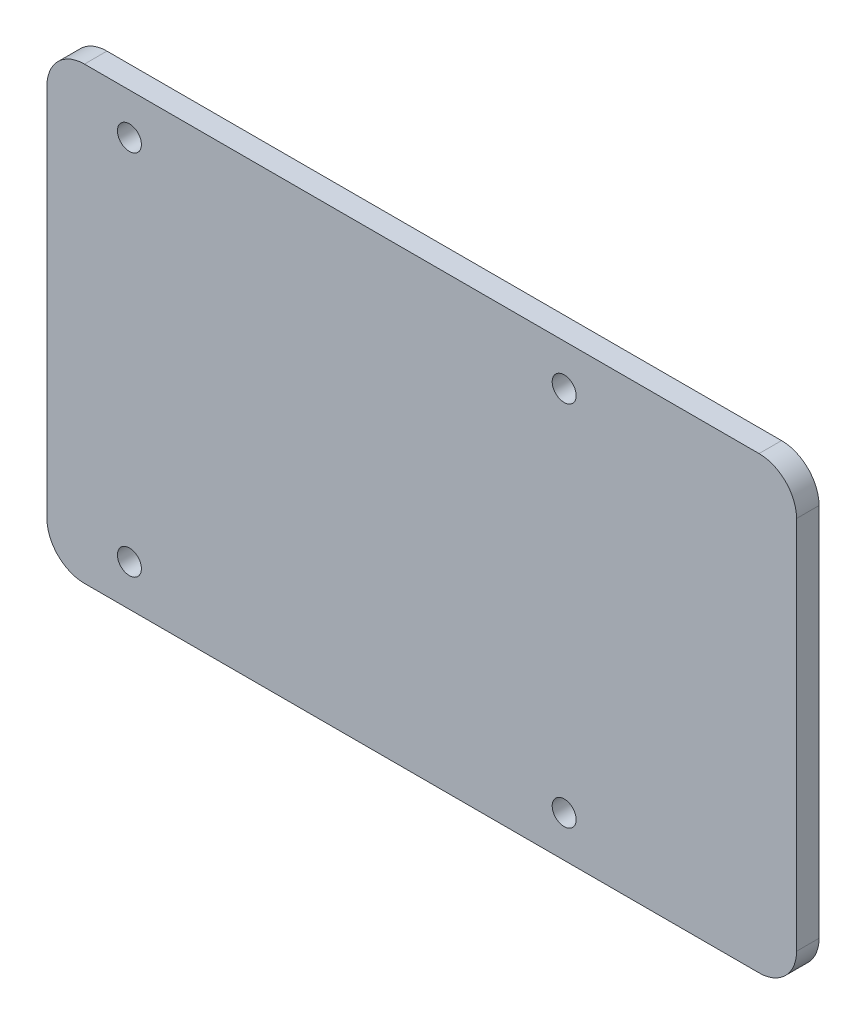
ISO-10303-21;
HEADER;
FILE_DESCRIPTION(('STEP AP214'),'2;1');
FILE_NAME('part.step','',(''),(''),'','','');
FILE_SCHEMA(('AUTOMOTIVE_DESIGN { 1 0 10303 214 1 1 1 1 }'));
ENDSEC;
DATA;
#1=APPLICATION_CONTEXT('core data for automotive mechanical design processes');
#2=APPLICATION_PROTOCOL_DEFINITION('international standard','automotive_design',2000,#1);
#3=PRODUCT_CONTEXT('',#1,'mechanical');
#4=PRODUCT('Part','Part','',(#3));
#5=PRODUCT_RELATED_PRODUCT_CATEGORY('part','',(#4));
#6=PRODUCT_DEFINITION_FORMATION('','',#4);
#7=PRODUCT_DEFINITION_CONTEXT('part definition',#1,'design');
#8=PRODUCT_DEFINITION('design','',#6,#7);
#9=PRODUCT_DEFINITION_SHAPE('','',#8);
#10=(LENGTH_UNIT() NAMED_UNIT(*) SI_UNIT(.MILLI.,.METRE.));
#11=(NAMED_UNIT(*) PLANE_ANGLE_UNIT() SI_UNIT($,.RADIAN.));
#12=(NAMED_UNIT(*) SI_UNIT($,.STERADIAN.) SOLID_ANGLE_UNIT());
#13=UNCERTAINTY_MEASURE_WITH_UNIT(LENGTH_MEASURE(1.E-05),#10,'distance_accuracy_value','');
#14=(GEOMETRIC_REPRESENTATION_CONTEXT(3) GLOBAL_UNCERTAINTY_ASSIGNED_CONTEXT((#13)) GLOBAL_UNIT_ASSIGNED_CONTEXT((#10,
#11,#12)) REPRESENTATION_CONTEXT('',''));
#15=CARTESIAN_POINT('',(0.,0.,0.));
#16=DIRECTION('',(0.,0.,1.));
#17=DIRECTION('',(1.,0.,0.));
#18=AXIS2_PLACEMENT_3D('',#15,#16,#17);
#19=CARTESIAN_POINT('',(-45.,-25.,3.));
#20=DIRECTION('',(0.,0.,1.));
#21=DIRECTION('',(1.,0.,0.));
#22=AXIS2_PLACEMENT_3D('',#19,#20,#21);
#23=PLANE('',#22);
#24=CARTESIAN_POINT('',(-39.,-24.5,3.));
#25=DIRECTION('',(0.,0.,1.));
#26=DIRECTION('',(1.,0.,0.));
#27=AXIS2_PLACEMENT_3D('',#24,#25,#26);
#28=CIRCLE('',#27,1.6);
#29=CARTESIAN_POINT('',(-37.4,-24.5,3.));
#30=VERTEX_POINT('',#29);
#31=EDGE_CURVE('E224',#30,#30,#28,.T.);
#32=ORIENTED_EDGE('',*,*,#31,.F.);
#33=EDGE_LOOP('',(#32));
#34=FACE_BOUND('',#33,.T.);
#35=CARTESIAN_POINT('',(19.,24.5,3.));
#36=DIRECTION('',(0.,0.,1.));
#37=DIRECTION('',(1.,0.,0.));
#38=AXIS2_PLACEMENT_3D('',#35,#36,#37);
#39=CIRCLE('',#38,1.6);
#40=CARTESIAN_POINT('',(20.6,24.5,3.));
#41=VERTEX_POINT('',#40);
#42=EDGE_CURVE('E149',#41,#41,#39,.T.);
#43=ORIENTED_EDGE('',*,*,#42,.F.);
#44=EDGE_LOOP('',(#43));
#45=FACE_BOUND('',#44,.T.);
#46=CARTESIAN_POINT('',(-45.,-25.,3.));
#47=DIRECTION('',(0.,0.,1.));
#48=DIRECTION('',(1.,0.,0.));
#49=AXIS2_PLACEMENT_3D('',#46,#47,#48);
#50=CIRCLE('',#49,5.);
#51=CARTESIAN_POINT('',(-50.,-25.,3.));
#52=VERTEX_POINT('',#51);
#53=CARTESIAN_POINT('',(-45.,-30.,3.));
#54=VERTEX_POINT('',#53);
#55=EDGE_CURVE('E167',#52,#54,#50,.T.);
#56=ORIENTED_EDGE('',*,*,#55,.T.);
#57=DIRECTION('',(1.,0.,0.));
#58=VECTOR('',#57,1.);
#59=CARTESIAN_POINT('',(-45.,-30.,3.));
#60=LINE('',#59,#58);
#61=CARTESIAN_POINT('',(45.,-30.,3.));
#62=VERTEX_POINT('',#61);
#63=EDGE_CURVE('E103',#54,#62,#60,.T.);
#64=ORIENTED_EDGE('',*,*,#63,.T.);
#65=CARTESIAN_POINT('',(45.,-25.,3.));
#66=DIRECTION('',(0.,0.,1.));
#67=DIRECTION('',(1.,0.,0.));
#68=AXIS2_PLACEMENT_3D('',#65,#66,#67);
#69=CIRCLE('',#68,5.);
#70=CARTESIAN_POINT('',(50.,-25.,3.));
#71=VERTEX_POINT('',#70);
#72=EDGE_CURVE('E188',#62,#71,#69,.T.);
#73=ORIENTED_EDGE('',*,*,#72,.T.);
#74=DIRECTION('',(0.,1.,0.));
#75=VECTOR('',#74,1.);
#76=CARTESIAN_POINT('',(50.,25.,3.));
#77=LINE('',#76,#75);
#78=CARTESIAN_POINT('',(50.,25.,3.));
#79=VERTEX_POINT('',#78);
#80=EDGE_CURVE('E202',#71,#79,#77,.T.);
#81=ORIENTED_EDGE('',*,*,#80,.T.);
#82=CARTESIAN_POINT('',(45.,25.,3.));
#83=DIRECTION('',(0.,0.,1.));
#84=DIRECTION('',(-1.,0.,0.));
#85=AXIS2_PLACEMENT_3D('',#82,#83,#84);
#86=CIRCLE('',#85,5.);
#87=CARTESIAN_POINT('',(45.,30.,3.));
#88=VERTEX_POINT('',#87);
#89=EDGE_CURVE('E122',#79,#88,#86,.T.);
#90=ORIENTED_EDGE('',*,*,#89,.T.);
#91=DIRECTION('',(-1.,0.,0.));
#92=VECTOR('',#91,1.);
#93=CARTESIAN_POINT('',(-45.,30.,3.));
#94=LINE('',#93,#92);
#95=CARTESIAN_POINT('',(-45.,30.,3.));
#96=VERTEX_POINT('',#95);
#97=EDGE_CURVE('E116',#88,#96,#94,.T.);
#98=ORIENTED_EDGE('',*,*,#97,.T.);
#99=CARTESIAN_POINT('',(-45.,25.,3.));
#100=DIRECTION('',(0.,0.,1.));
#101=DIRECTION('',(1.,0.,0.));
#102=AXIS2_PLACEMENT_3D('',#99,#100,#101);
#103=CIRCLE('',#102,5.);
#104=CARTESIAN_POINT('',(-50.,25.,3.));
#105=VERTEX_POINT('',#104);
#106=EDGE_CURVE('E120',#96,#105,#103,.T.);
#107=ORIENTED_EDGE('',*,*,#106,.T.);
#108=DIRECTION('',(0.,-1.,0.));
#109=VECTOR('',#108,1.);
#110=CARTESIAN_POINT('',(-50.,25.,3.));
#111=LINE('',#110,#109);
#112=EDGE_CURVE('E60',#105,#52,#111,.T.);
#113=ORIENTED_EDGE('',*,*,#112,.T.);
#114=EDGE_LOOP('',(#56,#64,#73,#81,#90,#98,#107,#113));
#115=FACE_BOUND('',#114,.T.);
#116=CARTESIAN_POINT('',(19.,-24.5,3.));
#117=DIRECTION('',(0.,0.,1.));
#118=DIRECTION('',(1.,0.,0.));
#119=AXIS2_PLACEMENT_3D('',#116,#117,#118);
#120=CIRCLE('',#119,1.6);
#121=CARTESIAN_POINT('',(20.6,-24.5,3.));
#122=VERTEX_POINT('',#121);
#123=EDGE_CURVE('E216',#122,#122,#120,.T.);
#124=ORIENTED_EDGE('',*,*,#123,.F.);
#125=EDGE_LOOP('',(#124));
#126=FACE_BOUND('',#125,.T.);
#127=CARTESIAN_POINT('',(-39.,24.5,3.));
#128=DIRECTION('',(0.,0.,1.));
#129=DIRECTION('',(1.,0.,0.));
#130=AXIS2_PLACEMENT_3D('',#127,#128,#129);
#131=CIRCLE('',#130,1.6);
#132=CARTESIAN_POINT('',(-37.4,24.5,3.));
#133=VERTEX_POINT('',#132);
#134=EDGE_CURVE('E232',#133,#133,#131,.T.);
#135=ORIENTED_EDGE('',*,*,#134,.F.);
#136=EDGE_LOOP('',(#135));
#137=FACE_BOUND('',#136,.T.);
#138=ADVANCED_FACE('F42',(#34,#45,#115,#126,#137),#23,.T.);
#139=CARTESIAN_POINT('',(-45.,-25.,0.));
#140=DIRECTION('',(0.,0.,1.));
#141=DIRECTION('',(1.,0.,0.));
#142=AXIS2_PLACEMENT_3D('',#139,#140,#141);
#143=PLANE('',#142);
#144=CARTESIAN_POINT('',(-45.,-25.,0.));
#145=DIRECTION('',(0.,0.,1.));
#146=DIRECTION('',(1.,0.,0.));
#147=AXIS2_PLACEMENT_3D('',#144,#145,#146);
#148=CIRCLE('',#147,5.);
#149=CARTESIAN_POINT('',(-50.,-25.,0.));
#150=VERTEX_POINT('',#149);
#151=CARTESIAN_POINT('',(-45.,-30.,0.));
#152=VERTEX_POINT('',#151);
#153=EDGE_CURVE('E144',#150,#152,#148,.T.);
#154=ORIENTED_EDGE('',*,*,#153,.F.);
#155=DIRECTION('',(0.,-1.,0.));
#156=VECTOR('',#155,1.);
#157=CARTESIAN_POINT('',(-50.,25.,0.));
#158=LINE('',#157,#156);
#159=CARTESIAN_POINT('',(-50.,25.,0.));
#160=VERTEX_POINT('',#159);
#161=EDGE_CURVE('E95',#160,#150,#158,.T.);
#162=ORIENTED_EDGE('',*,*,#161,.F.);
#163=CARTESIAN_POINT('',(-45.,25.,0.));
#164=DIRECTION('',(0.,0.,1.));
#165=DIRECTION('',(1.,0.,0.));
#166=AXIS2_PLACEMENT_3D('',#163,#164,#165);
#167=CIRCLE('',#166,5.);
#168=CARTESIAN_POINT('',(-45.,30.,0.));
#169=VERTEX_POINT('',#168);
#170=EDGE_CURVE('E89',#169,#160,#167,.T.);
#171=ORIENTED_EDGE('',*,*,#170,.F.);
#172=DIRECTION('',(-1.,0.,0.));
#173=VECTOR('',#172,1.);
#174=CARTESIAN_POINT('',(-45.,30.,0.));
#175=LINE('',#174,#173);
#176=CARTESIAN_POINT('',(45.,30.,0.));
#177=VERTEX_POINT('',#176);
#178=EDGE_CURVE('E131',#177,#169,#175,.T.);
#179=ORIENTED_EDGE('',*,*,#178,.F.);
#180=CARTESIAN_POINT('',(45.,25.,0.));
#181=DIRECTION('',(0.,0.,1.));
#182=DIRECTION('',(-1.,0.,0.));
#183=AXIS2_PLACEMENT_3D('',#180,#181,#182);
#184=CIRCLE('',#183,5.);
#185=CARTESIAN_POINT('',(50.,25.,0.));
#186=VERTEX_POINT('',#185);
#187=EDGE_CURVE('E158',#186,#177,#184,.T.);
#188=ORIENTED_EDGE('',*,*,#187,.F.);
#189=DIRECTION('',(0.,1.,0.));
#190=VECTOR('',#189,1.);
#191=CARTESIAN_POINT('',(50.,25.,0.));
#192=LINE('',#191,#190);
#193=CARTESIAN_POINT('',(50.,-25.,0.));
#194=VERTEX_POINT('',#193);
#195=EDGE_CURVE('E155',#194,#186,#192,.T.);
#196=ORIENTED_EDGE('',*,*,#195,.F.);
#197=CARTESIAN_POINT('',(45.,-25.,0.));
#198=DIRECTION('',(0.,0.,1.));
#199=DIRECTION('',(1.,0.,0.));
#200=AXIS2_PLACEMENT_3D('',#197,#198,#199);
#201=CIRCLE('',#200,5.);
#202=CARTESIAN_POINT('',(45.,-30.,0.));
#203=VERTEX_POINT('',#202);
#204=EDGE_CURVE('E152',#203,#194,#201,.T.);
#205=ORIENTED_EDGE('',*,*,#204,.F.);
#206=DIRECTION('',(1.,0.,0.));
#207=VECTOR('',#206,1.);
#208=CARTESIAN_POINT('',(-45.,-30.,0.));
#209=LINE('',#208,#207);
#210=EDGE_CURVE('E148',#152,#203,#209,.T.);
#211=ORIENTED_EDGE('',*,*,#210,.F.);
#212=EDGE_LOOP('',(#154,#162,#171,#179,#188,#196,#205,#211));
#213=FACE_BOUND('',#212,.T.);
#214=CARTESIAN_POINT('',(19.,24.5,0.));
#215=DIRECTION('',(0.,0.,1.));
#216=DIRECTION('',(1.,0.,0.));
#217=AXIS2_PLACEMENT_3D('',#214,#215,#216);
#218=CIRCLE('',#217,1.6);
#219=CARTESIAN_POINT('',(20.6,24.5,0.));
#220=VERTEX_POINT('',#219);
#221=EDGE_CURVE('E212',#220,#220,#218,.T.);
#222=ORIENTED_EDGE('',*,*,#221,.T.);
#223=EDGE_LOOP('',(#222));
#224=FACE_BOUND('',#223,.T.);
#225=CARTESIAN_POINT('',(19.,-24.5,0.));
#226=DIRECTION('',(0.,0.,1.));
#227=DIRECTION('',(1.,0.,0.));
#228=AXIS2_PLACEMENT_3D('',#225,#226,#227);
#229=CIRCLE('',#228,1.6);
#230=CARTESIAN_POINT('',(20.6,-24.5,0.));
#231=VERTEX_POINT('',#230);
#232=EDGE_CURVE('E220',#231,#231,#229,.T.);
#233=ORIENTED_EDGE('',*,*,#232,.T.);
#234=EDGE_LOOP('',(#233));
#235=FACE_BOUND('',#234,.T.);
#236=CARTESIAN_POINT('',(-39.,-24.5,0.));
#237=DIRECTION('',(0.,0.,1.));
#238=DIRECTION('',(1.,0.,0.));
#239=AXIS2_PLACEMENT_3D('',#236,#237,#238);
#240=CIRCLE('',#239,1.6);
#241=CARTESIAN_POINT('',(-37.4,-24.5,0.));
#242=VERTEX_POINT('',#241);
#243=EDGE_CURVE('E228',#242,#242,#240,.T.);
#244=ORIENTED_EDGE('',*,*,#243,.T.);
#245=EDGE_LOOP('',(#244));
#246=FACE_BOUND('',#245,.T.);
#247=CARTESIAN_POINT('',(-39.,24.5,0.));
#248=DIRECTION('',(0.,0.,1.));
#249=DIRECTION('',(1.,0.,0.));
#250=AXIS2_PLACEMENT_3D('',#247,#248,#249);
#251=CIRCLE('',#250,1.6);
#252=CARTESIAN_POINT('',(-37.4,24.5,0.));
#253=VERTEX_POINT('',#252);
#254=EDGE_CURVE('E236',#253,#253,#251,.T.);
#255=ORIENTED_EDGE('',*,*,#254,.T.);
#256=EDGE_LOOP('',(#255));
#257=FACE_BOUND('',#256,.T.);
#258=ADVANCED_FACE('F192',(#213,#224,#235,#246,#257),#143,.F.);
#259=CARTESIAN_POINT('',(-45.,-25.,3.));
#260=DIRECTION('',(0.,0.,-1.));
#261=DIRECTION('',(-1.,0.,0.));
#262=AXIS2_PLACEMENT_3D('',#259,#260,#261);
#263=CYLINDRICAL_SURFACE('',#262,5.);
#264=ORIENTED_EDGE('',*,*,#153,.T.);
#265=DIRECTION('',(0.,0.,-1.));
#266=VECTOR('',#265,1.);
#267=CARTESIAN_POINT('',(-45.,-30.,3.));
#268=LINE('',#267,#266);
#269=EDGE_CURVE('E11',#54,#152,#268,.T.);
#270=ORIENTED_EDGE('',*,*,#269,.F.);
#271=ORIENTED_EDGE('',*,*,#55,.F.);
#272=DIRECTION('',(0.,0.,-1.));
#273=VECTOR('',#272,1.);
#274=CARTESIAN_POINT('',(-50.,-25.,3.));
#275=LINE('',#274,#273);
#276=EDGE_CURVE('E140',#52,#150,#275,.T.);
#277=ORIENTED_EDGE('',*,*,#276,.T.);
#278=EDGE_LOOP('',(#264,#270,#271,#277));
#279=FACE_BOUND('',#278,.T.);
#280=ADVANCED_FACE('F44',(#279),#263,.T.);
#281=CARTESIAN_POINT('',(-45.,-30.,3.));
#282=DIRECTION('',(0.,1.,0.));
#283=DIRECTION('',(0.,0.,1.));
#284=AXIS2_PLACEMENT_3D('',#281,#282,#283);
#285=PLANE('',#284);
#286=ORIENTED_EDGE('',*,*,#210,.T.);
#287=DIRECTION('',(0.,0.,-1.));
#288=VECTOR('',#287,1.);
#289=CARTESIAN_POINT('',(45.,-30.,3.));
#290=LINE('',#289,#288);
#291=EDGE_CURVE('E52',#62,#203,#290,.T.);
#292=ORIENTED_EDGE('',*,*,#291,.F.);
#293=ORIENTED_EDGE('',*,*,#63,.F.);
#294=ORIENTED_EDGE('',*,*,#269,.T.);
#295=EDGE_LOOP('',(#286,#292,#293,#294));
#296=FACE_BOUND('',#295,.T.);
#297=ADVANCED_FACE('F272',(#296),#285,.F.);
#298=CARTESIAN_POINT('',(45.,-25.,3.));
#299=DIRECTION('',(0.,0.,-1.));
#300=DIRECTION('',(-1.,0.,0.));
#301=AXIS2_PLACEMENT_3D('',#298,#299,#300);
#302=CYLINDRICAL_SURFACE('',#301,5.);
#303=ORIENTED_EDGE('',*,*,#204,.T.);
#304=DIRECTION('',(0.,0.,-1.));
#305=VECTOR('',#304,1.);
#306=CARTESIAN_POINT('',(50.,-25.,3.));
#307=LINE('',#306,#305);
#308=EDGE_CURVE('E178',#71,#194,#307,.T.);
#309=ORIENTED_EDGE('',*,*,#308,.F.);
#310=ORIENTED_EDGE('',*,*,#72,.F.);
#311=ORIENTED_EDGE('',*,*,#291,.T.);
#312=EDGE_LOOP('',(#303,#309,#310,#311));
#313=FACE_BOUND('',#312,.T.);
#314=ADVANCED_FACE('F186',(#313),#302,.T.);
#315=CARTESIAN_POINT('',(50.,25.,3.));
#316=DIRECTION('',(-1.,0.,0.));
#317=DIRECTION('',(0.,-1.,0.));
#318=AXIS2_PLACEMENT_3D('',#315,#316,#317);
#319=PLANE('',#318);
#320=ORIENTED_EDGE('',*,*,#195,.T.);
#321=DIRECTION('',(0.,0.,-1.));
#322=VECTOR('',#321,1.);
#323=CARTESIAN_POINT('',(50.,25.,3.));
#324=LINE('',#323,#322);
#325=EDGE_CURVE('E174',#79,#186,#324,.T.);
#326=ORIENTED_EDGE('',*,*,#325,.F.);
#327=ORIENTED_EDGE('',*,*,#80,.F.);
#328=ORIENTED_EDGE('',*,*,#308,.T.);
#329=EDGE_LOOP('',(#320,#326,#327,#328));
#330=FACE_BOUND('',#329,.T.);
#331=ADVANCED_FACE('F197',(#330),#319,.F.);
#332=CARTESIAN_POINT('',(45.,25.,3.));
#333=DIRECTION('',(0.,0.,-1.));
#334=DIRECTION('',(-1.,0.,0.));
#335=AXIS2_PLACEMENT_3D('',#332,#333,#334);
#336=CYLINDRICAL_SURFACE('',#335,5.);
#337=ORIENTED_EDGE('',*,*,#187,.T.);
#338=DIRECTION('',(0.,0.,-1.));
#339=VECTOR('',#338,1.);
#340=CARTESIAN_POINT('',(45.,30.,3.));
#341=LINE('',#340,#339);
#342=EDGE_CURVE('E133',#88,#177,#341,.T.);
#343=ORIENTED_EDGE('',*,*,#342,.F.);
#344=ORIENTED_EDGE('',*,*,#89,.F.);
#345=ORIENTED_EDGE('',*,*,#325,.T.);
#346=EDGE_LOOP('',(#337,#343,#344,#345));
#347=FACE_BOUND('',#346,.T.);
#348=ADVANCED_FACE('F200',(#347),#336,.T.);
#349=CARTESIAN_POINT('',(-45.,30.,3.));
#350=DIRECTION('',(0.,-1.,0.));
#351=DIRECTION('',(0.,0.,-1.));
#352=AXIS2_PLACEMENT_3D('',#349,#350,#351);
#353=PLANE('',#352);
#354=ORIENTED_EDGE('',*,*,#178,.T.);
#355=DIRECTION('',(0.,0.,-1.));
#356=VECTOR('',#355,1.);
#357=CARTESIAN_POINT('',(-45.,30.,3.));
#358=LINE('',#357,#356);
#359=EDGE_CURVE('E128',#96,#169,#358,.T.);
#360=ORIENTED_EDGE('',*,*,#359,.F.);
#361=ORIENTED_EDGE('',*,*,#97,.F.);
#362=ORIENTED_EDGE('',*,*,#342,.T.);
#363=EDGE_LOOP('',(#354,#360,#361,#362));
#364=FACE_BOUND('',#363,.T.);
#365=ADVANCED_FACE('F129',(#364),#353,.F.);
#366=CARTESIAN_POINT('',(-45.,25.,3.));
#367=DIRECTION('',(0.,0.,-1.));
#368=DIRECTION('',(-1.,0.,0.));
#369=AXIS2_PLACEMENT_3D('',#366,#367,#368);
#370=CYLINDRICAL_SURFACE('',#369,5.);
#371=ORIENTED_EDGE('',*,*,#170,.T.);
#372=DIRECTION('',(0.,0.,-1.));
#373=VECTOR('',#372,1.);
#374=CARTESIAN_POINT('',(-50.,25.,3.));
#375=LINE('',#374,#373);
#376=EDGE_CURVE('E134',#105,#160,#375,.T.);
#377=ORIENTED_EDGE('',*,*,#376,.F.);
#378=ORIENTED_EDGE('',*,*,#106,.F.);
#379=ORIENTED_EDGE('',*,*,#359,.T.);
#380=EDGE_LOOP('',(#371,#377,#378,#379));
#381=FACE_BOUND('',#380,.T.);
#382=ADVANCED_FACE('F136',(#381),#370,.T.);
#383=CARTESIAN_POINT('',(-50.,25.,3.));
#384=DIRECTION('',(1.,0.,0.));
#385=DIRECTION('',(0.,1.,0.));
#386=AXIS2_PLACEMENT_3D('',#383,#384,#385);
#387=PLANE('',#386);
#388=ORIENTED_EDGE('',*,*,#161,.T.);
#389=ORIENTED_EDGE('',*,*,#276,.F.);
#390=ORIENTED_EDGE('',*,*,#112,.F.);
#391=ORIENTED_EDGE('',*,*,#376,.T.);
#392=EDGE_LOOP('',(#388,#389,#390,#391));
#393=FACE_BOUND('',#392,.T.);
#394=ADVANCED_FACE('F260',(#393),#387,.F.);
#395=CARTESIAN_POINT('',(19.,24.5,3.));
#396=DIRECTION('',(0.,0.,-1.));
#397=DIRECTION('',(-1.,0.,0.));
#398=AXIS2_PLACEMENT_3D('',#395,#396,#397);
#399=CYLINDRICAL_SURFACE('',#398,1.6);
#400=ORIENTED_EDGE('',*,*,#42,.T.);
#401=EDGE_LOOP('',(#400));
#402=FACE_BOUND('',#401,.T.);
#403=ORIENTED_EDGE('',*,*,#221,.F.);
#404=EDGE_LOOP('',(#403));
#405=FACE_BOUND('',#404,.T.);
#406=ADVANCED_FACE('F257',(#402,#405),#399,.F.);
#407=CARTESIAN_POINT('',(19.,-24.5,3.));
#408=DIRECTION('',(0.,0.,-1.));
#409=DIRECTION('',(-1.,0.,0.));
#410=AXIS2_PLACEMENT_3D('',#407,#408,#409);
#411=CYLINDRICAL_SURFACE('',#410,1.6);
#412=ORIENTED_EDGE('',*,*,#123,.T.);
#413=EDGE_LOOP('',(#412));
#414=FACE_BOUND('',#413,.T.);
#415=ORIENTED_EDGE('',*,*,#232,.F.);
#416=EDGE_LOOP('',(#415));
#417=FACE_BOUND('',#416,.T.);
#418=ADVANCED_FACE('F348',(#414,#417),#411,.F.);
#419=CARTESIAN_POINT('',(-39.,-24.5,3.));
#420=DIRECTION('',(0.,0.,-1.));
#421=DIRECTION('',(-1.,0.,0.));
#422=AXIS2_PLACEMENT_3D('',#419,#420,#421);
#423=CYLINDRICAL_SURFACE('',#422,1.6);
#424=ORIENTED_EDGE('',*,*,#31,.T.);
#425=EDGE_LOOP('',(#424));
#426=FACE_BOUND('',#425,.T.);
#427=ORIENTED_EDGE('',*,*,#243,.F.);
#428=EDGE_LOOP('',(#427));
#429=FACE_BOUND('',#428,.T.);
#430=ADVANCED_FACE('F357',(#426,#429),#423,.F.);
#431=CARTESIAN_POINT('',(-39.,24.5,3.));
#432=DIRECTION('',(0.,0.,-1.));
#433=DIRECTION('',(-1.,0.,0.));
#434=AXIS2_PLACEMENT_3D('',#431,#432,#433);
#435=CYLINDRICAL_SURFACE('',#434,1.6);
#436=ORIENTED_EDGE('',*,*,#134,.T.);
#437=EDGE_LOOP('',(#436));
#438=FACE_BOUND('',#437,.T.);
#439=ORIENTED_EDGE('',*,*,#254,.F.);
#440=EDGE_LOOP('',(#439));
#441=FACE_BOUND('',#440,.T.);
#442=ADVANCED_FACE('F244',(#438,#441),#435,.F.);
#443=CLOSED_SHELL('',(#138,#258,#280,#297,#314,#331,#348,#365,#382,#394,#406,#418,#430,#442));
#444=MANIFOLD_SOLID_BREP('B2',#443);
#445=ADVANCED_BREP_SHAPE_REPRESENTATION('',(#18,#444),#14);
#446=SHAPE_DEFINITION_REPRESENTATION(#9,#445);
ENDSEC;
END-ISO-10303-21;
